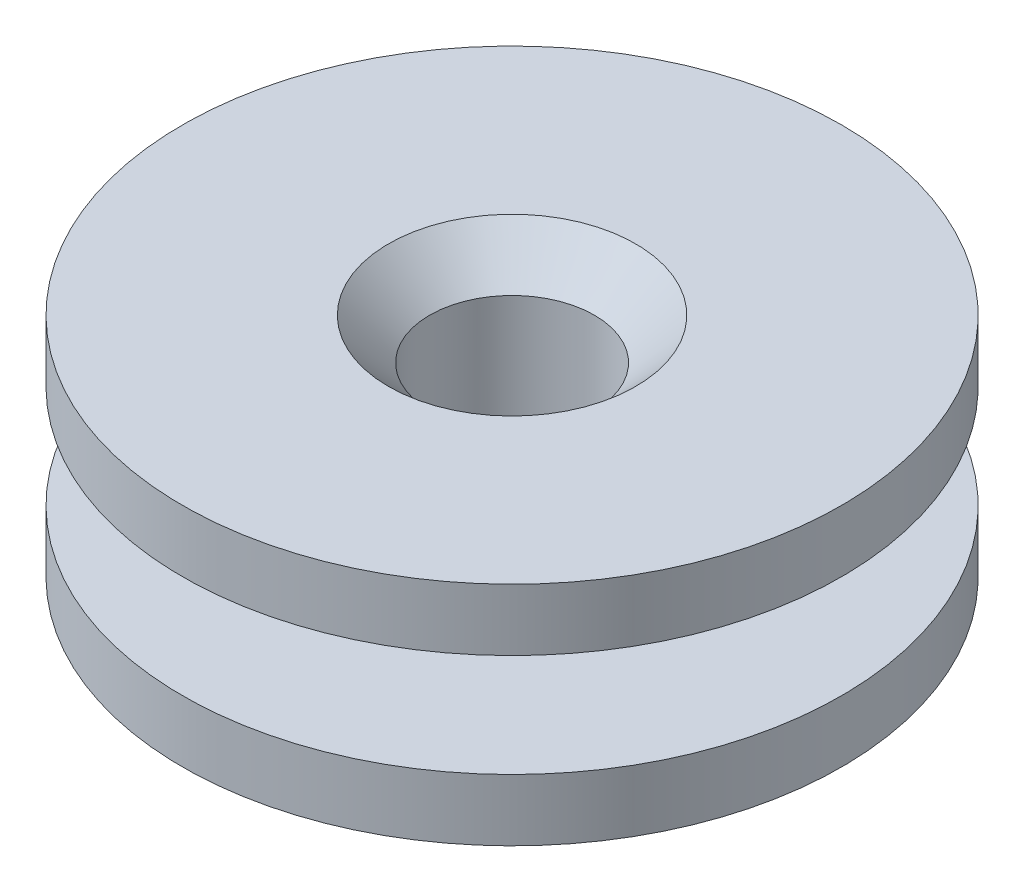
ISO-10303-21;
HEADER;
FILE_DESCRIPTION(('STEP AP214'),'2;1');
FILE_NAME('part.step','',(''),(''),'','','');
FILE_SCHEMA(('AUTOMOTIVE_DESIGN { 1 0 10303 214 1 1 1 1 }'));
ENDSEC;
DATA;
#1=APPLICATION_CONTEXT('core data for automotive mechanical design processes');
#2=APPLICATION_PROTOCOL_DEFINITION('international standard','automotive_design',2000,#1);
#3=PRODUCT_CONTEXT('',#1,'mechanical');
#4=PRODUCT('Part','Part','',(#3));
#5=PRODUCT_RELATED_PRODUCT_CATEGORY('part','',(#4));
#6=PRODUCT_DEFINITION_FORMATION('','',#4);
#7=PRODUCT_DEFINITION_CONTEXT('part definition',#1,'design');
#8=PRODUCT_DEFINITION('design','',#6,#7);
#9=PRODUCT_DEFINITION_SHAPE('','',#8);
#10=(LENGTH_UNIT() NAMED_UNIT(*) SI_UNIT(.MILLI.,.METRE.));
#11=(NAMED_UNIT(*) PLANE_ANGLE_UNIT() SI_UNIT($,.RADIAN.));
#12=(NAMED_UNIT(*) SI_UNIT($,.STERADIAN.) SOLID_ANGLE_UNIT());
#13=UNCERTAINTY_MEASURE_WITH_UNIT(LENGTH_MEASURE(1.E-05),#10,'distance_accuracy_value','');
#14=(GEOMETRIC_REPRESENTATION_CONTEXT(3) GLOBAL_UNCERTAINTY_ASSIGNED_CONTEXT((#13)) GLOBAL_UNIT_ASSIGNED_CONTEXT((#10,
#11,#12)) REPRESENTATION_CONTEXT('',''));
#15=CARTESIAN_POINT('',(0.,0.,0.));
#16=DIRECTION('',(0.,0.,1.));
#17=DIRECTION('',(1.,0.,0.));
#18=AXIS2_PLACEMENT_3D('',#15,#16,#17);
#19=CARTESIAN_POINT('',(16.,0.,0.));
#20=DIRECTION('',(0.,-1.,0.));
#21=DIRECTION('',(0.,0.,-1.));
#22=AXIS2_PLACEMENT_3D('',#19,#20,#21);
#23=PLANE('',#22);
#24=CARTESIAN_POINT('',(0.,0.,0.));
#25=DIRECTION('',(0.,-1.,0.));
#26=DIRECTION('',(0.,0.,-1.));
#27=AXIS2_PLACEMENT_3D('',#24,#25,#26);
#28=CIRCLE('',#27,5.99999999999999);
#29=CARTESIAN_POINT('',(0.,0.,-5.99999999999999));
#30=VERTEX_POINT('',#29);
#31=EDGE_CURVE('E41',#30,#30,#28,.F.);
#32=ORIENTED_EDGE('',*,*,#31,.T.);
#33=EDGE_LOOP('',(#32));
#34=FACE_BOUND('',#33,.T.);
#35=CARTESIAN_POINT('',(0.,0.,0.));
#36=DIRECTION('',(0.,-1.,0.));
#37=DIRECTION('',(0.,0.,-1.));
#38=AXIS2_PLACEMENT_3D('',#35,#36,#37);
#39=CIRCLE('',#38,16.);
#40=CARTESIAN_POINT('',(0.,0.,-16.));
#41=VERTEX_POINT('',#40);
#42=EDGE_CURVE('E69',#41,#41,#39,.T.);
#43=ORIENTED_EDGE('',*,*,#42,.T.);
#44=EDGE_LOOP('',(#43));
#45=FACE_BOUND('',#44,.T.);
#46=ADVANCED_FACE('F33',(#34,#45),#23,.T.);
#47=CARTESIAN_POINT('',(0.,0.,0.));
#48=DIRECTION('',(0.,-1.,0.));
#49=DIRECTION('',(0.,0.,-1.));
#50=AXIS2_PLACEMENT_3D('',#47,#48,#49);
#51=CYLINDRICAL_SURFACE('',#50,4.);
#52=CARTESIAN_POINT('',(0.,2.00000000000001,0.));
#53=DIRECTION('',(0.,-1.,0.));
#54=DIRECTION('',(0.,0.,-1.));
#55=AXIS2_PLACEMENT_3D('',#52,#53,#54);
#56=CIRCLE('',#55,4.);
#57=CARTESIAN_POINT('',(0.,2.00000000000001,-4.));
#58=VERTEX_POINT('',#57);
#59=EDGE_CURVE('E45',#58,#58,#56,.T.);
#60=ORIENTED_EDGE('',*,*,#59,.T.);
#61=EDGE_LOOP('',(#60));
#62=FACE_BOUND('',#61,.T.);
#63=CARTESIAN_POINT('',(0.,8.99999999999998,0.));
#64=DIRECTION('',(0.,1.,0.));
#65=DIRECTION('',(0.,0.,1.));
#66=AXIS2_PLACEMENT_3D('',#63,#64,#65);
#67=CIRCLE('',#66,4.);
#68=CARTESIAN_POINT('',(0.,8.99999999999998,4.));
#69=VERTEX_POINT('',#68);
#70=EDGE_CURVE('E49',#69,#69,#67,.T.);
#71=ORIENTED_EDGE('',*,*,#70,.T.);
#72=EDGE_LOOP('',(#71));
#73=FACE_BOUND('',#72,.T.);
#74=ADVANCED_FACE('F89',(#62,#73),#51,.F.);
#75=CARTESIAN_POINT('',(4.,11.,0.));
#76=DIRECTION('',(0.,1.,0.));
#77=DIRECTION('',(0.,0.,1.));
#78=AXIS2_PLACEMENT_3D('',#75,#76,#77);
#79=PLANE('',#78);
#80=CARTESIAN_POINT('',(0.,11.,0.));
#81=DIRECTION('',(0.,1.,0.));
#82=DIRECTION('',(0.,0.,1.));
#83=AXIS2_PLACEMENT_3D('',#80,#81,#82);
#84=CIRCLE('',#83,6.00000000000001);
#85=CARTESIAN_POINT('',(0.,11.,6.00000000000001));
#86=VERTEX_POINT('',#85);
#87=EDGE_CURVE('E10',#86,#86,#84,.F.);
#88=ORIENTED_EDGE('',*,*,#87,.T.);
#89=EDGE_LOOP('',(#88));
#90=FACE_BOUND('',#89,.T.);
#91=CARTESIAN_POINT('',(0.,11.,0.));
#92=DIRECTION('',(0.,-1.,0.));
#93=DIRECTION('',(0.,0.,-1.));
#94=AXIS2_PLACEMENT_3D('',#91,#92,#93);
#95=CIRCLE('',#94,16.);
#96=CARTESIAN_POINT('',(0.,11.,-16.));
#97=VERTEX_POINT('',#96);
#98=EDGE_CURVE('E54',#97,#97,#95,.T.);
#99=ORIENTED_EDGE('',*,*,#98,.F.);
#100=EDGE_LOOP('',(#99));
#101=FACE_BOUND('',#100,.T.);
#102=ADVANCED_FACE('F94',(#90,#101),#79,.T.);
#103=CARTESIAN_POINT('',(0.,0.,0.));
#104=DIRECTION('',(0.,-1.,0.));
#105=DIRECTION('',(0.,0.,-1.));
#106=AXIS2_PLACEMENT_3D('',#103,#104,#105);
#107=CYLINDRICAL_SURFACE('',#106,16.);
#108=ORIENTED_EDGE('',*,*,#98,.T.);
#109=EDGE_LOOP('',(#108));
#110=FACE_BOUND('',#109,.T.);
#111=CARTESIAN_POINT('',(0.,8.,0.));
#112=DIRECTION('',(0.,-1.,0.));
#113=DIRECTION('',(0.,0.,-1.));
#114=AXIS2_PLACEMENT_3D('',#111,#112,#113);
#115=CIRCLE('',#114,16.);
#116=CARTESIAN_POINT('',(0.,8.,-16.));
#117=VERTEX_POINT('',#116);
#118=EDGE_CURVE('E57',#117,#117,#115,.T.);
#119=ORIENTED_EDGE('',*,*,#118,.F.);
#120=EDGE_LOOP('',(#119));
#121=FACE_BOUND('',#120,.T.);
#122=ADVANCED_FACE('F105',(#110,#121),#107,.T.);
#123=CARTESIAN_POINT('',(16.,8.,0.));
#124=DIRECTION('',(0.,-1.,0.));
#125=DIRECTION('',(0.,0.,-1.));
#126=AXIS2_PLACEMENT_3D('',#123,#124,#125);
#127=PLANE('',#126);
#128=ORIENTED_EDGE('',*,*,#118,.T.);
#129=EDGE_LOOP('',(#128));
#130=FACE_BOUND('',#129,.T.);
#131=CARTESIAN_POINT('',(0.,8.,0.));
#132=DIRECTION('',(0.,-1.,0.));
#133=DIRECTION('',(0.,0.,-1.));
#134=AXIS2_PLACEMENT_3D('',#131,#132,#133);
#135=CIRCLE('',#134,8.);
#136=CARTESIAN_POINT('',(0.,8.,-8.));
#137=VERTEX_POINT('',#136);
#138=EDGE_CURVE('E60',#137,#137,#135,.T.);
#139=ORIENTED_EDGE('',*,*,#138,.F.);
#140=EDGE_LOOP('',(#139));
#141=FACE_BOUND('',#140,.T.);
#142=ADVANCED_FACE('F108',(#130,#141),#127,.T.);
#143=CARTESIAN_POINT('',(0.,0.,0.));
#144=DIRECTION('',(0.,-1.,0.));
#145=DIRECTION('',(0.,0.,-1.));
#146=AXIS2_PLACEMENT_3D('',#143,#144,#145);
#147=CYLINDRICAL_SURFACE('',#146,8.);
#148=ORIENTED_EDGE('',*,*,#138,.T.);
#149=EDGE_LOOP('',(#148));
#150=FACE_BOUND('',#149,.T.);
#151=CARTESIAN_POINT('',(0.,3.,0.));
#152=DIRECTION('',(0.,-1.,0.));
#153=DIRECTION('',(0.,0.,-1.));
#154=AXIS2_PLACEMENT_3D('',#151,#152,#153);
#155=CIRCLE('',#154,8.);
#156=CARTESIAN_POINT('',(0.,3.,-8.));
#157=VERTEX_POINT('',#156);
#158=EDGE_CURVE('E63',#157,#157,#155,.T.);
#159=ORIENTED_EDGE('',*,*,#158,.F.);
#160=EDGE_LOOP('',(#159));
#161=FACE_BOUND('',#160,.T.);
#162=ADVANCED_FACE('F85',(#150,#161),#147,.T.);
#163=CARTESIAN_POINT('',(8.,3.,0.));
#164=DIRECTION('',(0.,1.,0.));
#165=DIRECTION('',(0.,0.,1.));
#166=AXIS2_PLACEMENT_3D('',#163,#164,#165);
#167=PLANE('',#166);
#168=ORIENTED_EDGE('',*,*,#158,.T.);
#169=EDGE_LOOP('',(#168));
#170=FACE_BOUND('',#169,.T.);
#171=CARTESIAN_POINT('',(0.,3.,0.));
#172=DIRECTION('',(0.,-1.,0.));
#173=DIRECTION('',(0.,0.,-1.));
#174=AXIS2_PLACEMENT_3D('',#171,#172,#173);
#175=CIRCLE('',#174,16.);
#176=CARTESIAN_POINT('',(0.,3.,-16.));
#177=VERTEX_POINT('',#176);
#178=EDGE_CURVE('E66',#177,#177,#175,.T.);
#179=ORIENTED_EDGE('',*,*,#178,.F.);
#180=EDGE_LOOP('',(#179));
#181=FACE_BOUND('',#180,.T.);
#182=ADVANCED_FACE('F77',(#170,#181),#167,.T.);
#183=CARTESIAN_POINT('',(0.,0.,0.));
#184=DIRECTION('',(0.,-1.,0.));
#185=DIRECTION('',(0.,0.,-1.));
#186=AXIS2_PLACEMENT_3D('',#183,#184,#185);
#187=CYLINDRICAL_SURFACE('',#186,16.);
#188=ORIENTED_EDGE('',*,*,#178,.T.);
#189=EDGE_LOOP('',(#188));
#190=FACE_BOUND('',#189,.T.);
#191=ORIENTED_EDGE('',*,*,#42,.F.);
#192=EDGE_LOOP('',(#191));
#193=FACE_BOUND('',#192,.T.);
#194=ADVANCED_FACE('F74',(#190,#193),#187,.T.);
#195=CARTESIAN_POINT('',(0.,2.00000000000001,0.));
#196=DIRECTION('',(0.,-1.,0.));
#197=DIRECTION('',(0.,0.,-1.));
#198=AXIS2_PLACEMENT_3D('',#195,#196,#197);
#199=CONICAL_SURFACE('',#198,4.,0.785398163397446);
#200=ORIENTED_EDGE('',*,*,#31,.F.);
#201=EDGE_LOOP('',(#200));
#202=FACE_BOUND('',#201,.T.);
#203=ORIENTED_EDGE('',*,*,#59,.F.);
#204=EDGE_LOOP('',(#203));
#205=FACE_BOUND('',#204,.T.);
#206=ADVANCED_FACE('F76',(#202,#205),#199,.F.);
#207=CARTESIAN_POINT('',(0.,11.,0.));
#208=DIRECTION('',(0.,1.,0.));
#209=DIRECTION('',(0.,0.,1.));
#210=AXIS2_PLACEMENT_3D('',#207,#208,#209);
#211=CONICAL_SURFACE('',#210,6.00000000000001,0.785398163397445);
#212=ORIENTED_EDGE('',*,*,#70,.F.);
#213=EDGE_LOOP('',(#212));
#214=FACE_BOUND('',#213,.T.);
#215=ORIENTED_EDGE('',*,*,#87,.F.);
#216=EDGE_LOOP('',(#215));
#217=FACE_BOUND('',#216,.T.);
#218=ADVANCED_FACE('F36',(#214,#217),#211,.F.);
#219=CLOSED_SHELL('',(#46,#74,#102,#122,#142,#162,#182,#194,#206,#218));
#220=MANIFOLD_SOLID_BREP('B2',#219);
#221=ADVANCED_BREP_SHAPE_REPRESENTATION('',(#18,#220),#14);
#222=SHAPE_DEFINITION_REPRESENTATION(#9,#221);
ENDSEC;
END-ISO-10303-21;
